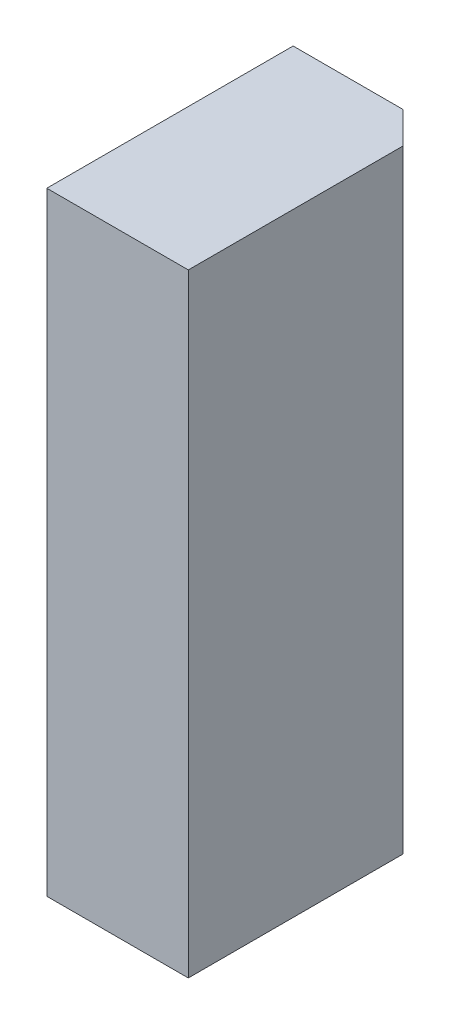
ISO-10303-21;
HEADER;
FILE_DESCRIPTION(('STEP AP214'),'2;1');
FILE_NAME('part.step','',(''),(''),'','','');
FILE_SCHEMA(('AUTOMOTIVE_DESIGN { 1 0 10303 214 1 1 1 1 }'));
ENDSEC;
DATA;
#1=APPLICATION_CONTEXT('core data for automotive mechanical design processes');
#2=APPLICATION_PROTOCOL_DEFINITION('international standard','automotive_design',2000,#1);
#3=PRODUCT_CONTEXT('',#1,'mechanical');
#4=PRODUCT('Part','Part','',(#3));
#5=PRODUCT_RELATED_PRODUCT_CATEGORY('part','',(#4));
#6=PRODUCT_DEFINITION_FORMATION('','',#4);
#7=PRODUCT_DEFINITION_CONTEXT('part definition',#1,'design');
#8=PRODUCT_DEFINITION('design','',#6,#7);
#9=PRODUCT_DEFINITION_SHAPE('','',#8);
#10=(LENGTH_UNIT() NAMED_UNIT(*) SI_UNIT(.MILLI.,.METRE.));
#11=(NAMED_UNIT(*) PLANE_ANGLE_UNIT() SI_UNIT($,.RADIAN.));
#12=(NAMED_UNIT(*) SI_UNIT($,.STERADIAN.) SOLID_ANGLE_UNIT());
#13=UNCERTAINTY_MEASURE_WITH_UNIT(LENGTH_MEASURE(1.E-05),#10,'distance_accuracy_value','');
#14=(GEOMETRIC_REPRESENTATION_CONTEXT(3) GLOBAL_UNCERTAINTY_ASSIGNED_CONTEXT((#13)) GLOBAL_UNIT_ASSIGNED_CONTEXT((#10,
#11,#12)) REPRESENTATION_CONTEXT('',''));
#15=CARTESIAN_POINT('',(0.,0.,0.));
#16=DIRECTION('',(0.,0.,1.));
#17=DIRECTION('',(1.,0.,0.));
#18=AXIS2_PLACEMENT_3D('',#15,#16,#17);
#19=CARTESIAN_POINT('',(-1.35,11.7,-2.34999999999999));
#20=DIRECTION('',(0.,0.,1.));
#21=DIRECTION('',(1.,0.,0.));
#22=AXIS2_PLACEMENT_3D('',#19,#20,#21);
#23=PLANE('',#22);
#24=DIRECTION('',(0.,-1.,0.));
#25=VECTOR('',#24,1.);
#26=CARTESIAN_POINT('',(0.749999999999995,11.7,-2.34999999999999));
#27=LINE('',#26,#25);
#28=CARTESIAN_POINT('',(0.749999999999994,11.7,-2.34999999999999));
#29=VERTEX_POINT('',#28);
#30=CARTESIAN_POINT('',(0.749999999999995,1.48989794855664,-2.34999999999999));
#31=VERTEX_POINT('',#30);
#32=EDGE_CURVE('E103',#29,#31,#27,.T.);
#33=ORIENTED_EDGE('',*,*,#32,.T.);
#34=DIRECTION('',(-1.,0.,0.));
#35=VECTOR('',#34,1.);
#36=CARTESIAN_POINT('',(1.351,1.48989794855664,-2.34999999999999));
#37=LINE('',#36,#35);
#38=CARTESIAN_POINT('',(-1.35,1.48989794855664,-2.34999999999999));
#39=VERTEX_POINT('',#38);
#40=EDGE_CURVE('E45',#39,#31,#37,.F.);
#41=ORIENTED_EDGE('',*,*,#40,.F.);
#42=DIRECTION('',(0.,-1.,0.));
#43=VECTOR('',#42,1.);
#44=CARTESIAN_POINT('',(-1.35,11.7,-2.34999999999999));
#45=LINE('',#44,#43);
#46=CARTESIAN_POINT('',(-1.35,11.7,-2.34999999999999));
#47=VERTEX_POINT('',#46);
#48=EDGE_CURVE('E100',#47,#39,#45,.T.);
#49=ORIENTED_EDGE('',*,*,#48,.F.);
#50=DIRECTION('',(-1.,0.,0.));
#51=VECTOR('',#50,1.);
#52=CARTESIAN_POINT('',(-1.35,11.7,-2.34999999999999));
#53=LINE('',#52,#51);
#54=EDGE_CURVE('E137',#29,#47,#53,.T.);
#55=ORIENTED_EDGE('',*,*,#54,.F.);
#56=EDGE_LOOP('',(#33,#41,#49,#55));
#57=FACE_BOUND('',#56,.T.);
#58=ADVANCED_FACE('F30',(#57),#23,.F.);
#59=CARTESIAN_POINT('',(1.35,11.7,-2.34999999999999));
#60=DIRECTION('',(-1.,0.,0.));
#61=DIRECTION('',(0.,0.,1.));
#62=AXIS2_PLACEMENT_3D('',#59,#60,#61);
#63=PLANE('',#62);
#64=DIRECTION('',(0.,0.,-1.));
#65=VECTOR('',#64,1.);
#66=CARTESIAN_POINT('',(1.35,0.,-2.34999999999999));
#67=LINE('',#66,#65);
#68=CARTESIAN_POINT('',(1.35,0.,2.35000000000002));
#69=VERTEX_POINT('',#68);
#70=CARTESIAN_POINT('',(1.35,0.,-1.74999999999999));
#71=VERTEX_POINT('',#70);
#72=EDGE_CURVE('E123',#69,#71,#67,.T.);
#73=ORIENTED_EDGE('',*,*,#72,.T.);
#74=DIRECTION('',(0.,1.,0.));
#75=VECTOR('',#74,1.);
#76=CARTESIAN_POINT('',(1.35,11.7,-1.74999999999999));
#77=LINE('',#76,#75);
#78=CARTESIAN_POINT('',(1.35,11.7,-1.74999999999999));
#79=VERTEX_POINT('',#78);
#80=EDGE_CURVE('E38',#71,#79,#77,.T.);
#81=ORIENTED_EDGE('',*,*,#80,.T.);
#82=DIRECTION('',(0.,0.,-1.));
#83=VECTOR('',#82,1.);
#84=CARTESIAN_POINT('',(1.35,11.7,-2.34999999999999));
#85=LINE('',#84,#83);
#86=CARTESIAN_POINT('',(1.35,11.7,2.35000000000002));
#87=VERTEX_POINT('',#86);
#88=EDGE_CURVE('E138',#87,#79,#85,.T.);
#89=ORIENTED_EDGE('',*,*,#88,.F.);
#90=DIRECTION('',(0.,-1.,0.));
#91=VECTOR('',#90,1.);
#92=CARTESIAN_POINT('',(1.35,11.7,2.35000000000002));
#93=LINE('',#92,#91);
#94=EDGE_CURVE('E132',#87,#69,#93,.T.);
#95=ORIENTED_EDGE('',*,*,#94,.T.);
#96=EDGE_LOOP('',(#73,#81,#89,#95));
#97=FACE_BOUND('',#96,.T.);
#98=ADVANCED_FACE('F130',(#97),#63,.F.);
#99=CARTESIAN_POINT('',(-1.35,0.510102051443362,-2.34999999999999));
#100=VERTEX_POINT('',#99);
#101=CARTESIAN_POINT('',(-1.35,0.,-2.34999999999999));
#102=VERTEX_POINT('',#101);
#103=EDGE_CURVE('E109',#100,#102,#45,.T.);
#104=ORIENTED_EDGE('',*,*,#103,.F.);
#105=DIRECTION('',(-1.,0.,0.));
#106=VECTOR('',#105,1.);
#107=CARTESIAN_POINT('',(1.351,0.510102051443363,-2.34999999999999));
#108=LINE('',#107,#106);
#109=CARTESIAN_POINT('',(0.749999999999995,0.510102051443365,-2.34999999999999));
#110=VERTEX_POINT('',#109);
#111=EDGE_CURVE('E90',#110,#100,#108,.T.);
#112=ORIENTED_EDGE('',*,*,#111,.F.);
#113=CARTESIAN_POINT('',(0.749999999999995,0.,-2.34999999999999));
#114=VERTEX_POINT('',#113);
#115=EDGE_CURVE('E108',#110,#114,#27,.T.);
#116=ORIENTED_EDGE('',*,*,#115,.T.);
#117=DIRECTION('',(-1.,0.,0.));
#118=VECTOR('',#117,1.);
#119=CARTESIAN_POINT('',(-1.35,0.,-2.34999999999999));
#120=LINE('',#119,#118);
#121=EDGE_CURVE('E126',#114,#102,#120,.T.);
#122=ORIENTED_EDGE('',*,*,#121,.T.);
#123=EDGE_LOOP('',(#104,#112,#116,#122));
#124=FACE_BOUND('',#123,.T.);
#125=ADVANCED_FACE('F155',(#124),#23,.F.);
#126=CARTESIAN_POINT('',(-1.35,11.7,-2.34999999999999));
#127=DIRECTION('',(1.,0.,0.));
#128=DIRECTION('',(0.,0.,-1.));
#129=AXIS2_PLACEMENT_3D('',#126,#127,#128);
#130=PLANE('',#129);
#131=ORIENTED_EDGE('',*,*,#48,.T.);
#132=CARTESIAN_POINT('',(-1.35,1.,-2.44999999999998));
#133=DIRECTION('',(-1.,0.,0.));
#134=DIRECTION('',(0.,0.,1.));
#135=AXIS2_PLACEMENT_3D('',#132,#133,#134);
#136=CIRCLE('',#135,0.5);
#137=EDGE_CURVE('E87',#100,#39,#136,.T.);
#138=ORIENTED_EDGE('',*,*,#137,.F.);
#139=ORIENTED_EDGE('',*,*,#103,.T.);
#140=DIRECTION('',(0.,0.,1.));
#141=VECTOR('',#140,1.);
#142=CARTESIAN_POINT('',(-1.35,0.,-2.34999999999999));
#143=LINE('',#142,#141);
#144=CARTESIAN_POINT('',(-1.35,0.,2.35000000000002));
#145=VERTEX_POINT('',#144);
#146=EDGE_CURVE('E148',#102,#145,#143,.T.);
#147=ORIENTED_EDGE('',*,*,#146,.T.);
#148=DIRECTION('',(0.,-1.,0.));
#149=VECTOR('',#148,1.);
#150=CARTESIAN_POINT('',(-1.35,11.7,2.35000000000002));
#151=LINE('',#150,#149);
#152=CARTESIAN_POINT('',(-1.35,11.7,2.35000000000002));
#153=VERTEX_POINT('',#152);
#154=EDGE_CURVE('E112',#153,#145,#151,.T.);
#155=ORIENTED_EDGE('',*,*,#154,.F.);
#156=DIRECTION('',(0.,0.,1.));
#157=VECTOR('',#156,1.);
#158=CARTESIAN_POINT('',(-1.35,11.7,-2.34999999999999));
#159=LINE('',#158,#157);
#160=EDGE_CURVE('E107',#47,#153,#159,.T.);
#161=ORIENTED_EDGE('',*,*,#160,.F.);
#162=EDGE_LOOP('',(#131,#138,#139,#147,#155,#161));
#163=FACE_BOUND('',#162,.T.);
#164=ADVANCED_FACE('F105',(#163),#130,.F.);
#165=CARTESIAN_POINT('',(-1.35,11.7,2.35000000000002));
#166=DIRECTION('',(0.,0.,-1.));
#167=DIRECTION('',(-1.,0.,0.));
#168=AXIS2_PLACEMENT_3D('',#165,#166,#167);
#169=PLANE('',#168);
#170=DIRECTION('',(1.,0.,0.));
#171=VECTOR('',#170,1.);
#172=CARTESIAN_POINT('',(-1.35,0.,2.35000000000002));
#173=LINE('',#172,#171);
#174=EDGE_CURVE('E142',#145,#69,#173,.T.);
#175=ORIENTED_EDGE('',*,*,#174,.T.);
#176=ORIENTED_EDGE('',*,*,#94,.F.);
#177=DIRECTION('',(1.,0.,0.));
#178=VECTOR('',#177,1.);
#179=CARTESIAN_POINT('',(-1.35,11.7,2.35000000000002));
#180=LINE('',#179,#178);
#181=EDGE_CURVE('E140',#153,#87,#180,.T.);
#182=ORIENTED_EDGE('',*,*,#181,.F.);
#183=ORIENTED_EDGE('',*,*,#154,.T.);
#184=EDGE_LOOP('',(#175,#176,#182,#183));
#185=FACE_BOUND('',#184,.T.);
#186=ADVANCED_FACE('F153',(#185),#169,.F.);
#187=CARTESIAN_POINT('',(1.35,11.7,2.35000000000002));
#188=DIRECTION('',(0.,1.,0.));
#189=DIRECTION('',(0.,0.,1.));
#190=AXIS2_PLACEMENT_3D('',#187,#188,#189);
#191=PLANE('',#190);
#192=ORIENTED_EDGE('',*,*,#88,.T.);
#193=DIRECTION('',(0.707106781186548,0.,0.707106781186548));
#194=VECTOR('',#193,1.);
#195=CARTESIAN_POINT('',(3.4,11.7,0.300000000000015));
#196=LINE('',#195,#194);
#197=EDGE_CURVE('E11',#79,#29,#196,.F.);
#198=ORIENTED_EDGE('',*,*,#197,.T.);
#199=ORIENTED_EDGE('',*,*,#54,.T.);
#200=ORIENTED_EDGE('',*,*,#160,.T.);
#201=ORIENTED_EDGE('',*,*,#181,.T.);
#202=EDGE_LOOP('',(#192,#198,#199,#200,#201));
#203=FACE_BOUND('',#202,.T.);
#204=ADVANCED_FACE('F136',(#203),#191,.T.);
#205=CARTESIAN_POINT('',(1.35,0.,2.35000000000002));
#206=DIRECTION('',(0.,1.,0.));
#207=DIRECTION('',(0.,0.,1.));
#208=AXIS2_PLACEMENT_3D('',#205,#206,#207);
#209=PLANE('',#208);
#210=ORIENTED_EDGE('',*,*,#121,.F.);
#211=DIRECTION('',(-0.707106781186548,0.,-0.707106781186548));
#212=VECTOR('',#211,1.);
#213=CARTESIAN_POINT('',(0.749999999999995,0.,-2.34999999999999));
#214=LINE('',#213,#212);
#215=EDGE_CURVE('E116',#114,#71,#214,.F.);
#216=ORIENTED_EDGE('',*,*,#215,.T.);
#217=ORIENTED_EDGE('',*,*,#72,.F.);
#218=ORIENTED_EDGE('',*,*,#174,.F.);
#219=ORIENTED_EDGE('',*,*,#146,.F.);
#220=EDGE_LOOP('',(#210,#216,#217,#218,#219));
#221=FACE_BOUND('',#220,.T.);
#222=ADVANCED_FACE('F121',(#221),#209,.F.);
#223=CARTESIAN_POINT('',(0.749999999999995,11.7,-2.34999999999999));
#224=DIRECTION('',(-0.707106781186547,0.,0.707106781186547));
#225=DIRECTION('',(0.707106781186548,0.,0.707106781186548));
#226=AXIS2_PLACEMENT_3D('',#223,#224,#225);
#227=PLANE('',#226);
#228=CARTESIAN_POINT('',(0.650000000000005,1.,-2.44999999999998));
#229=DIRECTION('',(-0.707106781186547,0.,0.707106781186547));
#230=DIRECTION('',(-0.707106781186548,0.,-0.707106781186548));
#231=AXIS2_PLACEMENT_3D('',#228,#229,#230);
#232=ELLIPSE('',#231,0.707106781186547,0.5);
#233=EDGE_CURVE('E94',#110,#31,#232,.T.);
#234=ORIENTED_EDGE('',*,*,#233,.T.);
#235=ORIENTED_EDGE('',*,*,#32,.F.);
#236=ORIENTED_EDGE('',*,*,#197,.F.);
#237=ORIENTED_EDGE('',*,*,#80,.F.);
#238=ORIENTED_EDGE('',*,*,#215,.F.);
#239=ORIENTED_EDGE('',*,*,#115,.F.);
#240=EDGE_LOOP('',(#234,#235,#236,#237,#238,#239));
#241=FACE_BOUND('',#240,.T.);
#242=ADVANCED_FACE('F32',(#241),#227,.F.);
#243=CARTESIAN_POINT('',(1.351,1.,-2.44999999999998));
#244=DIRECTION('',(-1.,0.,0.));
#245=DIRECTION('',(0.,0.,1.));
#246=AXIS2_PLACEMENT_3D('',#243,#244,#245);
#247=CYLINDRICAL_SURFACE('',#246,0.5);
#248=ORIENTED_EDGE('',*,*,#40,.T.);
#249=ORIENTED_EDGE('',*,*,#233,.F.);
#250=ORIENTED_EDGE('',*,*,#111,.T.);
#251=ORIENTED_EDGE('',*,*,#137,.T.);
#252=EDGE_LOOP('',(#248,#249,#250,#251));
#253=FACE_BOUND('',#252,.T.);
#254=ADVANCED_FACE('F88',(#253),#247,.F.);
#255=CLOSED_SHELL('',(#58,#98,#125,#164,#186,#204,#222,#242,#254));
#256=MANIFOLD_SOLID_BREP('B2',#255);
#257=ADVANCED_BREP_SHAPE_REPRESENTATION('',(#18,#256),#14);
#258=SHAPE_DEFINITION_REPRESENTATION(#9,#257);
ENDSEC;
END-ISO-10303-21;
